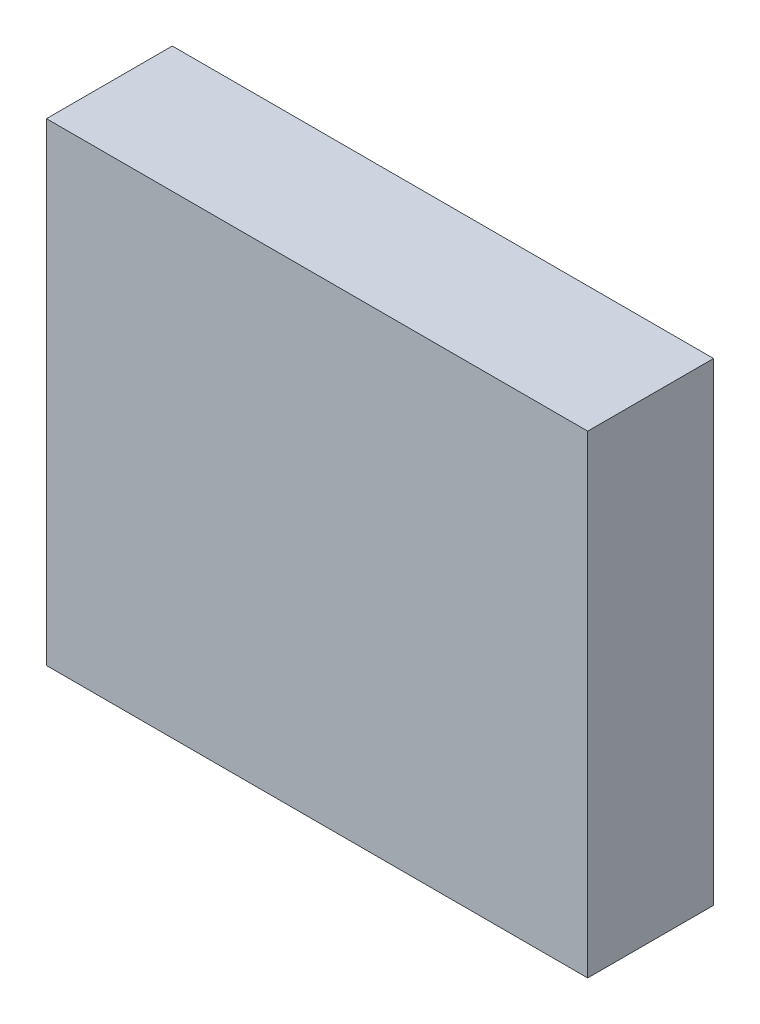
ISO-10303-21;
HEADER;
FILE_DESCRIPTION(('STEP AP214'),'2;1');
FILE_NAME('part.step','',(''),(''),'','','');
FILE_SCHEMA(('AUTOMOTIVE_DESIGN { 1 0 10303 214 1 1 1 1 }'));
ENDSEC;
DATA;
#1=APPLICATION_CONTEXT('core data for automotive mechanical design processes');
#2=APPLICATION_PROTOCOL_DEFINITION('international standard','automotive_design',2000,#1);
#3=PRODUCT_CONTEXT('',#1,'mechanical');
#4=PRODUCT('Part','Part','',(#3));
#5=PRODUCT_RELATED_PRODUCT_CATEGORY('part','',(#4));
#6=PRODUCT_DEFINITION_FORMATION('','',#4);
#7=PRODUCT_DEFINITION_CONTEXT('part definition',#1,'design');
#8=PRODUCT_DEFINITION('design','',#6,#7);
#9=PRODUCT_DEFINITION_SHAPE('','',#8);
#10=(LENGTH_UNIT() NAMED_UNIT(*) SI_UNIT(.MILLI.,.METRE.));
#11=(NAMED_UNIT(*) PLANE_ANGLE_UNIT() SI_UNIT($,.RADIAN.));
#12=(NAMED_UNIT(*) SI_UNIT($,.STERADIAN.) SOLID_ANGLE_UNIT());
#13=UNCERTAINTY_MEASURE_WITH_UNIT(LENGTH_MEASURE(1.E-05),#10,'distance_accuracy_value','');
#14=(GEOMETRIC_REPRESENTATION_CONTEXT(3) GLOBAL_UNCERTAINTY_ASSIGNED_CONTEXT((#13)) GLOBAL_UNIT_ASSIGNED_CONTEXT((#10,
#11,#12)) REPRESENTATION_CONTEXT('',''));
#15=CARTESIAN_POINT('',(0.,0.,0.));
#16=DIRECTION('',(0.,0.,1.));
#17=DIRECTION('',(1.,0.,0.));
#18=AXIS2_PLACEMENT_3D('',#15,#16,#17);
#19=CARTESIAN_POINT('',(-0.999998,-0.87499952,0.46500034));
#20=DIRECTION('',(0.,0.,-1.));
#21=DIRECTION('',(-1.,0.,0.));
#22=AXIS2_PLACEMENT_3D('',#19,#20,#21);
#23=PLANE('',#22);
#24=DIRECTION('',(0.,1.,0.));
#25=VECTOR('',#24,1.);
#26=CARTESIAN_POINT('',(1.00000054,-0.87499952,0.46500034));
#27=LINE('',#26,#25);
#28=CARTESIAN_POINT('',(1.00000054,-0.87499952,0.46500034));
#29=VERTEX_POINT('',#28);
#30=CARTESIAN_POINT('',(1.00000054,0.87500206,0.46500034));
#31=VERTEX_POINT('',#30);
#32=EDGE_CURVE('E54',#29,#31,#27,.T.);
#33=ORIENTED_EDGE('',*,*,#32,.T.);
#34=DIRECTION('',(1.,0.,0.));
#35=VECTOR('',#34,1.);
#36=CARTESIAN_POINT('',(1.00000054,0.87500206,0.46500034));
#37=LINE('',#36,#35);
#38=CARTESIAN_POINT('',(-0.999998,0.87500206,0.46500034));
#39=VERTEX_POINT('',#38);
#40=EDGE_CURVE('E56',#31,#39,#37,.F.);
#41=ORIENTED_EDGE('',*,*,#40,.T.);
#42=DIRECTION('',(0.,1.,0.));
#43=VECTOR('',#42,1.);
#44=CARTESIAN_POINT('',(-0.999998,0.87500206,0.46500034));
#45=LINE('',#44,#43);
#46=CARTESIAN_POINT('',(-0.999998,-0.87499952,0.46500034));
#47=VERTEX_POINT('',#46);
#48=EDGE_CURVE('E19',#39,#47,#45,.F.);
#49=ORIENTED_EDGE('',*,*,#48,.T.);
#50=DIRECTION('',(1.,0.,0.));
#51=VECTOR('',#50,1.);
#52=CARTESIAN_POINT('',(-0.999998,-0.87499952,0.46500034));
#53=LINE('',#52,#51);
#54=EDGE_CURVE('E79',#47,#29,#53,.T.);
#55=ORIENTED_EDGE('',*,*,#54,.T.);
#56=EDGE_LOOP('',(#33,#41,#49,#55));
#57=FACE_BOUND('',#56,.T.);
#58=ADVANCED_FACE('F16',(#57),#23,.F.);
#59=CARTESIAN_POINT('',(-0.999998,0.87500206,0.));
#60=DIRECTION('',(1.,0.,0.));
#61=DIRECTION('',(0.,0.,-1.));
#62=AXIS2_PLACEMENT_3D('',#59,#60,#61);
#63=PLANE('',#62);
#64=DIRECTION('',(0.,0.,1.));
#65=VECTOR('',#64,1.);
#66=CARTESIAN_POINT('',(-0.999998,-0.87499952,0.));
#67=LINE('',#66,#65);
#68=CARTESIAN_POINT('',(-0.999998,-0.87499952,0.));
#69=VERTEX_POINT('',#68);
#70=EDGE_CURVE('E67',#69,#47,#67,.T.);
#71=ORIENTED_EDGE('',*,*,#70,.T.);
#72=ORIENTED_EDGE('',*,*,#48,.F.);
#73=DIRECTION('',(0.,0.,-1.));
#74=VECTOR('',#73,1.);
#75=CARTESIAN_POINT('',(-0.999998,0.87500206,0.));
#76=LINE('',#75,#74);
#77=CARTESIAN_POINT('',(-0.999998,0.87500206,0.));
#78=VERTEX_POINT('',#77);
#79=EDGE_CURVE('E62',#39,#78,#76,.T.);
#80=ORIENTED_EDGE('',*,*,#79,.T.);
#81=DIRECTION('',(0.,1.,0.));
#82=VECTOR('',#81,1.);
#83=CARTESIAN_POINT('',(-0.999998,-0.87499952,0.));
#84=LINE('',#83,#82);
#85=EDGE_CURVE('E82',#69,#78,#84,.T.);
#86=ORIENTED_EDGE('',*,*,#85,.F.);
#87=EDGE_LOOP('',(#71,#72,#80,#86));
#88=FACE_BOUND('',#87,.T.);
#89=ADVANCED_FACE('F64',(#88),#63,.F.);
#90=CARTESIAN_POINT('',(1.00000054,0.87500206,0.));
#91=DIRECTION('',(0.,-1.,0.));
#92=DIRECTION('',(0.,0.,-1.));
#93=AXIS2_PLACEMENT_3D('',#90,#91,#92);
#94=PLANE('',#93);
#95=ORIENTED_EDGE('',*,*,#79,.F.);
#96=ORIENTED_EDGE('',*,*,#40,.F.);
#97=DIRECTION('',(0.,0.,1.));
#98=VECTOR('',#97,1.);
#99=CARTESIAN_POINT('',(1.00000054,0.87500206,0.));
#100=LINE('',#99,#98);
#101=CARTESIAN_POINT('',(1.00000054,0.87500206,0.));
#102=VERTEX_POINT('',#101);
#103=EDGE_CURVE('E74',#31,#102,#100,.F.);
#104=ORIENTED_EDGE('',*,*,#103,.T.);
#105=DIRECTION('',(-1.,0.,0.));
#106=VECTOR('',#105,1.);
#107=CARTESIAN_POINT('',(-0.999998,0.87500206,0.));
#108=LINE('',#107,#106);
#109=EDGE_CURVE('E71',#78,#102,#108,.F.);
#110=ORIENTED_EDGE('',*,*,#109,.F.);
#111=EDGE_LOOP('',(#95,#96,#104,#110));
#112=FACE_BOUND('',#111,.T.);
#113=ADVANCED_FACE('F69',(#112),#94,.F.);
#114=CARTESIAN_POINT('',(1.00000054,-0.87499952,0.));
#115=DIRECTION('',(-1.,0.,0.));
#116=DIRECTION('',(0.,0.,1.));
#117=AXIS2_PLACEMENT_3D('',#114,#115,#116);
#118=PLANE('',#117);
#119=ORIENTED_EDGE('',*,*,#103,.F.);
#120=ORIENTED_EDGE('',*,*,#32,.F.);
#121=DIRECTION('',(0.,0.,1.));
#122=VECTOR('',#121,1.);
#123=CARTESIAN_POINT('',(1.00000054,-0.87499952,0.));
#124=LINE('',#123,#122);
#125=CARTESIAN_POINT('',(1.00000054,-0.87499952,0.));
#126=VERTEX_POINT('',#125);
#127=EDGE_CURVE('E34',#29,#126,#124,.F.);
#128=ORIENTED_EDGE('',*,*,#127,.T.);
#129=DIRECTION('',(0.,1.,0.));
#130=VECTOR('',#129,1.);
#131=CARTESIAN_POINT('',(1.00000054,-0.87499952,0.));
#132=LINE('',#131,#130);
#133=EDGE_CURVE('E25',#102,#126,#132,.F.);
#134=ORIENTED_EDGE('',*,*,#133,.F.);
#135=EDGE_LOOP('',(#119,#120,#128,#134));
#136=FACE_BOUND('',#135,.T.);
#137=ADVANCED_FACE('F88',(#136),#118,.F.);
#138=CARTESIAN_POINT('',(-0.999998,-0.87499952,0.));
#139=DIRECTION('',(0.,1.,0.));
#140=DIRECTION('',(0.,0.,1.));
#141=AXIS2_PLACEMENT_3D('',#138,#139,#140);
#142=PLANE('',#141);
#143=ORIENTED_EDGE('',*,*,#127,.F.);
#144=ORIENTED_EDGE('',*,*,#54,.F.);
#145=ORIENTED_EDGE('',*,*,#70,.F.);
#146=DIRECTION('',(-1.,0.,0.));
#147=VECTOR('',#146,1.);
#148=CARTESIAN_POINT('',(-0.999998,-0.87499952,0.));
#149=LINE('',#148,#147);
#150=EDGE_CURVE('E11',#126,#69,#149,.T.);
#151=ORIENTED_EDGE('',*,*,#150,.F.);
#152=EDGE_LOOP('',(#143,#144,#145,#151));
#153=FACE_BOUND('',#152,.T.);
#154=ADVANCED_FACE('F90',(#153),#142,.F.);
#155=CARTESIAN_POINT('',(-0.999998,-0.87499952,0.));
#156=DIRECTION('',(0.,0.,-1.));
#157=DIRECTION('',(-1.,0.,0.));
#158=AXIS2_PLACEMENT_3D('',#155,#156,#157);
#159=PLANE('',#158);
#160=ORIENTED_EDGE('',*,*,#133,.T.);
#161=ORIENTED_EDGE('',*,*,#150,.T.);
#162=ORIENTED_EDGE('',*,*,#85,.T.);
#163=ORIENTED_EDGE('',*,*,#109,.T.);
#164=EDGE_LOOP('',(#160,#161,#162,#163));
#165=FACE_BOUND('',#164,.T.);
#166=ADVANCED_FACE('F87',(#165),#159,.T.);
#167=CLOSED_SHELL('',(#58,#89,#113,#137,#154,#166));
#168=MANIFOLD_SOLID_BREP('B1',#167);
#169=ADVANCED_BREP_SHAPE_REPRESENTATION('',(#18,#168),#14);
#170=SHAPE_DEFINITION_REPRESENTATION(#9,#169);
ENDSEC;
END-ISO-10303-21;
